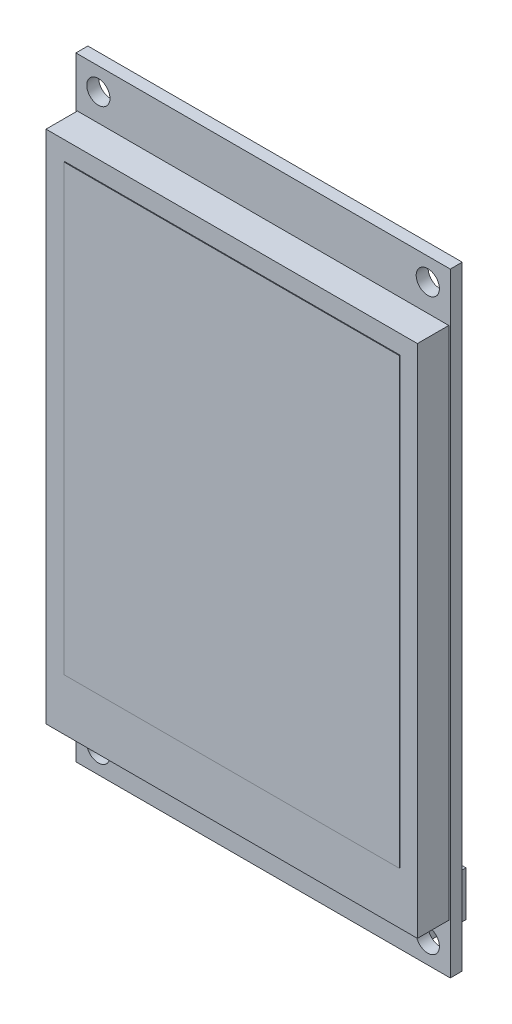
ISO-10303-21;
HEADER;
FILE_DESCRIPTION(('STEP AP214'),'2;1');
FILE_NAME('part.step','',(''),(''),'','','');
FILE_SCHEMA(('AUTOMOTIVE_DESIGN { 1 0 10303 214 1 1 1 1 }'));
ENDSEC;
DATA;
#1=APPLICATION_CONTEXT('core data for automotive mechanical design processes');
#2=APPLICATION_PROTOCOL_DEFINITION('international standard','automotive_design',2000,#1);
#3=PRODUCT_CONTEXT('',#1,'mechanical');
#4=PRODUCT('Part','Part','',(#3));
#5=PRODUCT_RELATED_PRODUCT_CATEGORY('part','',(#4));
#6=PRODUCT_DEFINITION_FORMATION('','',#4);
#7=PRODUCT_DEFINITION_CONTEXT('part definition',#1,'design');
#8=PRODUCT_DEFINITION('design','',#6,#7);
#9=PRODUCT_DEFINITION_SHAPE('','',#8);
#10=(LENGTH_UNIT() NAMED_UNIT(*) SI_UNIT(.MILLI.,.METRE.));
#11=(NAMED_UNIT(*) PLANE_ANGLE_UNIT() SI_UNIT($,.RADIAN.));
#12=(NAMED_UNIT(*) SI_UNIT($,.STERADIAN.) SOLID_ANGLE_UNIT());
#13=UNCERTAINTY_MEASURE_WITH_UNIT(LENGTH_MEASURE(1.E-05),#10,'distance_accuracy_value','');
#14=(GEOMETRIC_REPRESENTATION_CONTEXT(3) GLOBAL_UNCERTAINTY_ASSIGNED_CONTEXT((#13)) GLOBAL_UNIT_ASSIGNED_CONTEXT((#10,
#11,#12)) REPRESENTATION_CONTEXT('',''));
#15=CARTESIAN_POINT('',(0.,0.,0.));
#16=DIRECTION('',(0.,0.,1.));
#17=DIRECTION('',(1.,0.,0.));
#18=AXIS2_PLACEMENT_3D('',#15,#16,#17);
#19=CARTESIAN_POINT('',(25.,-39.,0.));
#20=DIRECTION('',(0.,0.,-1.));
#21=DIRECTION('',(-1.,0.,0.));
#22=AXIS2_PLACEMENT_3D('',#19,#20,#21);
#23=PLANE('',#22);
#24=CARTESIAN_POINT('',(22.,40.,0.));
#25=DIRECTION('',(0.,0.,1.));
#26=DIRECTION('',(1.,0.,0.));
#27=AXIS2_PLACEMENT_3D('',#24,#25,#26);
#28=CIRCLE('',#27,1.55);
#29=CARTESIAN_POINT('',(23.55,40.,0.));
#30=VERTEX_POINT('',#29);
#31=EDGE_CURVE('E405',#30,#30,#28,.T.);
#32=ORIENTED_EDGE('',*,*,#31,.T.);
#33=EDGE_LOOP('',(#32));
#34=FACE_BOUND('',#33,.T.);
#35=CARTESIAN_POINT('',(-22.,-36.07972028525,0.));
#36=DIRECTION('',(0.,0.,1.));
#37=DIRECTION('',(1.,0.,0.));
#38=AXIS2_PLACEMENT_3D('',#35,#36,#37);
#39=CIRCLE('',#38,1.55);
#40=CARTESIAN_POINT('',(-20.45,-36.07972028525,0.));
#41=VERTEX_POINT('',#40);
#42=EDGE_CURVE('E394',#41,#41,#39,.T.);
#43=ORIENTED_EDGE('',*,*,#42,.T.);
#44=EDGE_LOOP('',(#43));
#45=FACE_BOUND('',#44,.T.);
#46=CARTESIAN_POINT('',(22.,-36.08,0.));
#47=DIRECTION('',(0.,0.,1.));
#48=DIRECTION('',(1.,0.,0.));
#49=AXIS2_PLACEMENT_3D('',#46,#47,#48);
#50=CIRCLE('',#49,1.55);
#51=CARTESIAN_POINT('',(23.55,-36.08,0.));
#52=VERTEX_POINT('',#51);
#53=EDGE_CURVE('E391',#52,#52,#50,.T.);
#54=ORIENTED_EDGE('',*,*,#53,.T.);
#55=EDGE_LOOP('',(#54));
#56=FACE_BOUND('',#55,.T.);
#57=CARTESIAN_POINT('',(-22.,40.,0.));
#58=DIRECTION('',(0.,0.,1.));
#59=DIRECTION('',(1.,0.,0.));
#60=AXIS2_PLACEMENT_3D('',#57,#58,#59);
#61=CIRCLE('',#60,1.55);
#62=CARTESIAN_POINT('',(-20.45,40.,0.));
#63=VERTEX_POINT('',#62);
#64=EDGE_CURVE('E409',#63,#63,#61,.T.);
#65=ORIENTED_EDGE('',*,*,#64,.T.);
#66=EDGE_LOOP('',(#65));
#67=FACE_BOUND('',#66,.T.);
#68=DIRECTION('',(0.,-1.,0.));
#69=VECTOR('',#68,1.);
#70=CARTESIAN_POINT('',(-14.,15.2,0.));
#71=LINE('',#70,#69);
#72=CARTESIAN_POINT('',(-14.,17.2,0.));
#73=VERTEX_POINT('',#72);
#74=CARTESIAN_POINT('',(-14.,15.2,0.));
#75=VERTEX_POINT('',#74);
#76=EDGE_CURVE('E68',#73,#75,#71,.T.);
#77=ORIENTED_EDGE('',*,*,#76,.F.);
#78=DIRECTION('',(1.,0.,0.));
#79=VECTOR('',#78,1.);
#80=CARTESIAN_POINT('',(-14.,17.2,0.));
#81=LINE('',#80,#79);
#82=CARTESIAN_POINT('',(-25.,17.2,0.));
#83=VERTEX_POINT('',#82);
#84=EDGE_CURVE('E482',#83,#73,#81,.T.);
#85=ORIENTED_EDGE('',*,*,#84,.F.);
#86=DIRECTION('',(0.,1.,0.));
#87=VECTOR('',#86,1.);
#88=CARTESIAN_POINT('',(-25.,-39.,0.));
#89=LINE('',#88,#87);
#90=CARTESIAN_POINT('',(-25.,43.,0.));
#91=VERTEX_POINT('',#90);
#92=EDGE_CURVE('E273',#83,#91,#89,.T.);
#93=ORIENTED_EDGE('',*,*,#92,.T.);
#94=DIRECTION('',(-1.,0.,0.));
#95=VECTOR('',#94,1.);
#96=CARTESIAN_POINT('',(25.,43.,0.));
#97=LINE('',#96,#95);
#98=CARTESIAN_POINT('',(25.,43.,0.));
#99=VERTEX_POINT('',#98);
#100=EDGE_CURVE('E444',#99,#91,#97,.T.);
#101=ORIENTED_EDGE('',*,*,#100,.F.);
#102=DIRECTION('',(0.,1.,0.));
#103=VECTOR('',#102,1.);
#104=CARTESIAN_POINT('',(25.,-39.,0.));
#105=LINE('',#104,#103);
#106=CARTESIAN_POINT('',(25.,-39.,0.));
#107=VERTEX_POINT('',#106);
#108=EDGE_CURVE('E60',#107,#99,#105,.T.);
#109=ORIENTED_EDGE('',*,*,#108,.F.);
#110=DIRECTION('',(-1.,0.,0.));
#111=VECTOR('',#110,1.);
#112=CARTESIAN_POINT('',(25.,-39.,0.));
#113=LINE('',#112,#111);
#114=CARTESIAN_POINT('',(18.5,-39.,0.));
#115=VERTEX_POINT('',#114);
#116=EDGE_CURVE('E454',#107,#115,#113,.T.);
#117=ORIENTED_EDGE('',*,*,#116,.T.);
#118=DIRECTION('',(0.,-1.,0.));
#119=VECTOR('',#118,1.);
#120=CARTESIAN_POINT('',(18.5,-39.8,0.));
#121=LINE('',#120,#119);
#122=CARTESIAN_POINT('',(18.5,-33.8,0.));
#123=VERTEX_POINT('',#122);
#124=EDGE_CURVE('E376',#123,#115,#121,.T.);
#125=ORIENTED_EDGE('',*,*,#124,.F.);
#126=DIRECTION('',(1.,0.,0.));
#127=VECTOR('',#126,1.);
#128=CARTESIAN_POINT('',(-18.5,-33.8,0.));
#129=LINE('',#128,#127);
#130=CARTESIAN_POINT('',(-18.5,-33.8,0.));
#131=VERTEX_POINT('',#130);
#132=EDGE_CURVE('E375',#131,#123,#129,.T.);
#133=ORIENTED_EDGE('',*,*,#132,.F.);
#134=DIRECTION('',(0.,1.,0.));
#135=VECTOR('',#134,1.);
#136=CARTESIAN_POINT('',(-18.5,-39.8,0.));
#137=LINE('',#136,#135);
#138=CARTESIAN_POINT('',(-18.5,-39.,0.));
#139=VERTEX_POINT('',#138);
#140=EDGE_CURVE('E11',#139,#131,#137,.T.);
#141=ORIENTED_EDGE('',*,*,#140,.F.);
#142=CARTESIAN_POINT('',(-25.,-39.,0.));
#143=VERTEX_POINT('',#142);
#144=EDGE_CURVE('E460',#139,#143,#113,.T.);
#145=ORIENTED_EDGE('',*,*,#144,.T.);
#146=CARTESIAN_POINT('',(-25.,-8.80000000000002,0.));
#147=VERTEX_POINT('',#146);
#148=EDGE_CURVE('E55',#143,#147,#89,.T.);
#149=ORIENTED_EDGE('',*,*,#148,.T.);
#150=DIRECTION('',(-1.,0.,0.));
#151=VECTOR('',#150,1.);
#152=CARTESIAN_POINT('',(-25.,-8.80000000000002,0.));
#153=LINE('',#152,#151);
#154=CARTESIAN_POINT('',(-7.00000000000001,-8.80000000000002,0.));
#155=VERTEX_POINT('',#154);
#156=EDGE_CURVE('E269',#155,#147,#153,.T.);
#157=ORIENTED_EDGE('',*,*,#156,.F.);
#158=DIRECTION('',(0.,-1.,0.));
#159=VECTOR('',#158,1.);
#160=CARTESIAN_POINT('',(-7.,-8.80000000000002,0.));
#161=LINE('',#160,#159);
#162=CARTESIAN_POINT('',(-6.99999999999999,14.2,0.));
#163=VERTEX_POINT('',#162);
#164=EDGE_CURVE('E1005',#163,#155,#161,.T.);
#165=ORIENTED_EDGE('',*,*,#164,.F.);
#166=DIRECTION('',(1.,0.,0.));
#167=VECTOR('',#166,1.);
#168=CARTESIAN_POINT('',(-13.,14.2,0.));
#169=LINE('',#168,#167);
#170=CARTESIAN_POINT('',(-13.,14.2,0.));
#171=VERTEX_POINT('',#170);
#172=EDGE_CURVE('E1007',#171,#163,#169,.T.);
#173=ORIENTED_EDGE('',*,*,#172,.F.);
#174=DIRECTION('',(0.707106781186547,-0.707106781186547,0.));
#175=VECTOR('',#174,1.);
#176=CARTESIAN_POINT('',(-13.,14.2,0.));
#177=LINE('',#176,#175);
#178=EDGE_CURVE('E72',#75,#171,#177,.T.);
#179=ORIENTED_EDGE('',*,*,#178,.F.);
#180=EDGE_LOOP('',(#77,#85,#93,#101,#109,#117,#125,#133,#141,#145,#149,#157,#165,#173,#179));
#181=FACE_BOUND('',#180,.T.);
#182=ADVANCED_FACE('F47',(#34,#45,#56,#67,#181),#23,.T.);
#183=CARTESIAN_POINT('',(25.,-39.,1.6));
#184=DIRECTION('',(1.,0.,0.));
#185=DIRECTION('',(0.,0.,-1.));
#186=AXIS2_PLACEMENT_3D('',#183,#184,#185);
#187=PLANE('',#186);
#188=DIRECTION('',(0.,0.,-1.));
#189=VECTOR('',#188,1.);
#190=CARTESIAN_POINT('',(25.,43.,1.6));
#191=LINE('',#190,#189);
#192=CARTESIAN_POINT('',(25.,43.,1.6));
#193=VERTEX_POINT('',#192);
#194=EDGE_CURVE('E475',#193,#99,#191,.T.);
#195=ORIENTED_EDGE('',*,*,#194,.F.);
#196=DIRECTION('',(0.,1.,0.));
#197=VECTOR('',#196,1.);
#198=CARTESIAN_POINT('',(25.,-39.,1.6));
#199=LINE('',#198,#197);
#200=CARTESIAN_POINT('',(25.,-39.,1.6));
#201=VERTEX_POINT('',#200);
#202=EDGE_CURVE('E476',#201,#193,#199,.T.);
#203=ORIENTED_EDGE('',*,*,#202,.F.);
#204=DIRECTION('',(0.,0.,-1.));
#205=VECTOR('',#204,1.);
#206=CARTESIAN_POINT('',(25.,-39.,1.6));
#207=LINE('',#206,#205);
#208=EDGE_CURVE('E462',#201,#107,#207,.T.);
#209=ORIENTED_EDGE('',*,*,#208,.T.);
#210=ORIENTED_EDGE('',*,*,#108,.T.);
#211=EDGE_LOOP('',(#195,#203,#209,#210));
#212=FACE_BOUND('',#211,.T.);
#213=ADVANCED_FACE('F487',(#212),#187,.T.);
#214=CARTESIAN_POINT('',(-25.,-39.,1.6));
#215=DIRECTION('',(0.,0.,1.));
#216=DIRECTION('',(1.,0.,0.));
#217=AXIS2_PLACEMENT_3D('',#214,#215,#216);
#218=PLANE('',#217);
#219=CARTESIAN_POINT('',(22.,40.,1.6));
#220=DIRECTION('',(0.,0.,1.));
#221=DIRECTION('',(1.,0.,0.));
#222=AXIS2_PLACEMENT_3D('',#219,#220,#221);
#223=CIRCLE('',#222,1.55);
#224=CARTESIAN_POINT('',(23.55,40.,1.6));
#225=VERTEX_POINT('',#224);
#226=EDGE_CURVE('E397',#225,#225,#223,.T.);
#227=ORIENTED_EDGE('',*,*,#226,.F.);
#228=EDGE_LOOP('',(#227));
#229=FACE_BOUND('',#228,.T.);
#230=CARTESIAN_POINT('',(-22.,-36.07972028525,1.6));
#231=DIRECTION('',(0.,0.,1.));
#232=DIRECTION('',(1.,0.,0.));
#233=AXIS2_PLACEMENT_3D('',#230,#231,#232);
#234=CIRCLE('',#233,1.55);
#235=CARTESIAN_POINT('',(-20.45,-36.07972028525,1.6));
#236=VERTEX_POINT('',#235);
#237=EDGE_CURVE('E403',#236,#236,#234,.T.);
#238=ORIENTED_EDGE('',*,*,#237,.F.);
#239=EDGE_LOOP('',(#238));
#240=FACE_BOUND('',#239,.T.);
#241=CARTESIAN_POINT('',(22.,-36.08,1.6));
#242=DIRECTION('',(0.,0.,1.));
#243=DIRECTION('',(1.,0.,0.));
#244=AXIS2_PLACEMENT_3D('',#241,#242,#243);
#245=CIRCLE('',#244,1.55);
#246=CARTESIAN_POINT('',(23.55,-36.08,1.6));
#247=VERTEX_POINT('',#246);
#248=EDGE_CURVE('E395',#247,#247,#245,.T.);
#249=ORIENTED_EDGE('',*,*,#248,.F.);
#250=EDGE_LOOP('',(#249));
#251=FACE_BOUND('',#250,.T.);
#252=CARTESIAN_POINT('',(-22.,40.,1.6));
#253=DIRECTION('',(0.,0.,1.));
#254=DIRECTION('',(1.,0.,0.));
#255=AXIS2_PLACEMENT_3D('',#252,#253,#254);
#256=CIRCLE('',#255,1.55);
#257=CARTESIAN_POINT('',(-20.45,40.,1.6));
#258=VERTEX_POINT('',#257);
#259=EDGE_CURVE('E402',#258,#258,#256,.T.);
#260=ORIENTED_EDGE('',*,*,#259,.F.);
#261=EDGE_LOOP('',(#260));
#262=FACE_BOUND('',#261,.T.);
#263=DIRECTION('',(0.,1.,0.));
#264=VECTOR('',#263,1.);
#265=CARTESIAN_POINT('',(24.8,-32.42100667811,1.6));
#266=LINE('',#265,#264);
#267=CARTESIAN_POINT('',(24.8,-32.42100667811,1.6));
#268=VERTEX_POINT('',#267);
#269=CARTESIAN_POINT('',(24.8,36.378993321881,1.6));
#270=VERTEX_POINT('',#269);
#271=EDGE_CURVE('E412',#268,#270,#266,.T.);
#272=ORIENTED_EDGE('',*,*,#271,.F.);
#273=DIRECTION('',(1.,0.,0.));
#274=VECTOR('',#273,1.);
#275=CARTESIAN_POINT('',(-24.8,-32.42100667811,1.6));
#276=LINE('',#275,#274);
#277=CARTESIAN_POINT('',(-24.8,-32.42100667811,1.6));
#278=VERTEX_POINT('',#277);
#279=EDGE_CURVE('E424',#278,#268,#276,.T.);
#280=ORIENTED_EDGE('',*,*,#279,.F.);
#281=DIRECTION('',(0.,-1.,0.));
#282=VECTOR('',#281,1.);
#283=CARTESIAN_POINT('',(-24.8,36.378993321881,1.6));
#284=LINE('',#283,#282);
#285=CARTESIAN_POINT('',(-24.8,36.378993321881,1.6));
#286=VERTEX_POINT('',#285);
#287=EDGE_CURVE('E423',#286,#278,#284,.T.);
#288=ORIENTED_EDGE('',*,*,#287,.F.);
#289=DIRECTION('',(-1.,0.,0.));
#290=VECTOR('',#289,1.);
#291=CARTESIAN_POINT('',(24.8,36.378993321881,1.6));
#292=LINE('',#291,#290);
#293=EDGE_CURVE('E416',#270,#286,#292,.T.);
#294=ORIENTED_EDGE('',*,*,#293,.F.);
#295=EDGE_LOOP('',(#272,#280,#288,#294));
#296=FACE_BOUND('',#295,.T.);
#297=DIRECTION('',(1.,0.,0.));
#298=VECTOR('',#297,1.);
#299=CARTESIAN_POINT('',(-25.,43.,1.6));
#300=LINE('',#299,#298);
#301=CARTESIAN_POINT('',(-25.,43.,1.6));
#302=VERTEX_POINT('',#301);
#303=EDGE_CURVE('E473',#302,#193,#300,.T.);
#304=ORIENTED_EDGE('',*,*,#303,.F.);
#305=DIRECTION('',(0.,1.,0.));
#306=VECTOR('',#305,1.);
#307=CARTESIAN_POINT('',(-25.,-39.,1.6));
#308=LINE('',#307,#306);
#309=CARTESIAN_POINT('',(-25.,-39.,1.6));
#310=VERTEX_POINT('',#309);
#311=EDGE_CURVE('E479',#310,#302,#308,.T.);
#312=ORIENTED_EDGE('',*,*,#311,.F.);
#313=DIRECTION('',(1.,0.,0.));
#314=VECTOR('',#313,1.);
#315=CARTESIAN_POINT('',(-25.,-39.,1.6));
#316=LINE('',#315,#314);
#317=EDGE_CURVE('E458',#310,#201,#316,.T.);
#318=ORIENTED_EDGE('',*,*,#317,.T.);
#319=ORIENTED_EDGE('',*,*,#202,.T.);
#320=EDGE_LOOP('',(#304,#312,#318,#319));
#321=FACE_BOUND('',#320,.T.);
#322=ADVANCED_FACE('F502',(#229,#240,#251,#262,#296,#321),#218,.T.);
#323=CARTESIAN_POINT('',(-25.,-39.,0.));
#324=DIRECTION('',(-1.,0.,0.));
#325=DIRECTION('',(0.,0.,1.));
#326=AXIS2_PLACEMENT_3D('',#323,#324,#325);
#327=PLANE('',#326);
#328=DIRECTION('',(0.,0.,1.));
#329=VECTOR('',#328,1.);
#330=CARTESIAN_POINT('',(-25.,43.,0.));
#331=LINE('',#330,#329);
#332=EDGE_CURVE('E467',#91,#302,#331,.T.);
#333=ORIENTED_EDGE('',*,*,#332,.F.);
#334=ORIENTED_EDGE('',*,*,#92,.F.);
#335=DIRECTION('',(0.,0.,1.));
#336=VECTOR('',#335,1.);
#337=CARTESIAN_POINT('',(-25.,17.2,-3.7));
#338=LINE('',#337,#336);
#339=CARTESIAN_POINT('',(-25.,17.2,-3.7));
#340=VERTEX_POINT('',#339);
#341=EDGE_CURVE('E254',#340,#83,#338,.T.);
#342=ORIENTED_EDGE('',*,*,#341,.F.);
#343=DIRECTION('',(0.,1.,0.));
#344=VECTOR('',#343,1.);
#345=CARTESIAN_POINT('',(-25.,17.2,-3.7));
#346=LINE('',#345,#344);
#347=CARTESIAN_POINT('',(-25.,-8.80000000000002,-3.7));
#348=VERTEX_POINT('',#347);
#349=EDGE_CURVE('E261',#348,#340,#346,.T.);
#350=ORIENTED_EDGE('',*,*,#349,.F.);
#351=DIRECTION('',(0.,0.,1.));
#352=VECTOR('',#351,1.);
#353=CARTESIAN_POINT('',(-25.,-8.80000000000002,-3.7));
#354=LINE('',#353,#352);
#355=EDGE_CURVE('E501',#348,#147,#354,.T.);
#356=ORIENTED_EDGE('',*,*,#355,.T.);
#357=ORIENTED_EDGE('',*,*,#148,.F.);
#358=DIRECTION('',(0.,0.,1.));
#359=VECTOR('',#358,1.);
#360=CARTESIAN_POINT('',(-25.,-39.,0.));
#361=LINE('',#360,#359);
#362=EDGE_CURVE('E451',#143,#310,#361,.T.);
#363=ORIENTED_EDGE('',*,*,#362,.T.);
#364=ORIENTED_EDGE('',*,*,#311,.T.);
#365=EDGE_LOOP('',(#333,#334,#342,#350,#356,#357,#363,#364));
#366=FACE_BOUND('',#365,.T.);
#367=ADVANCED_FACE('F272',(#366),#327,.T.);
#368=CARTESIAN_POINT('',(0.,-39.,0.));
#369=DIRECTION('',(0.,1.,0.));
#370=DIRECTION('',(0.,0.,1.));
#371=AXIS2_PLACEMENT_3D('',#368,#369,#370);
#372=PLANE('',#371);
#373=ORIENTED_EDGE('',*,*,#116,.F.);
#374=ORIENTED_EDGE('',*,*,#208,.F.);
#375=ORIENTED_EDGE('',*,*,#317,.F.);
#376=ORIENTED_EDGE('',*,*,#362,.F.);
#377=ORIENTED_EDGE('',*,*,#144,.F.);
#378=EDGE_CURVE('E457',#115,#139,#113,.T.);
#379=ORIENTED_EDGE('',*,*,#378,.F.);
#380=EDGE_LOOP('',(#373,#374,#375,#376,#377,#379));
#381=FACE_BOUND('',#380,.T.);
#382=ADVANCED_FACE('F493',(#381),#372,.F.);
#383=CARTESIAN_POINT('',(0.,43.,0.));
#384=DIRECTION('',(0.,1.,0.));
#385=DIRECTION('',(0.,0.,1.));
#386=AXIS2_PLACEMENT_3D('',#383,#384,#385);
#387=PLANE('',#386);
#388=ORIENTED_EDGE('',*,*,#100,.T.);
#389=ORIENTED_EDGE('',*,*,#332,.T.);
#390=ORIENTED_EDGE('',*,*,#303,.T.);
#391=ORIENTED_EDGE('',*,*,#194,.T.);
#392=EDGE_LOOP('',(#388,#389,#390,#391));
#393=FACE_BOUND('',#392,.T.);
#394=ADVANCED_FACE('F486',(#393),#387,.T.);
#395=CARTESIAN_POINT('',(-24.8,-32.42100667811,288600.291716034));
#396=DIRECTION('',(0.,1.,0.));
#397=DIRECTION('',(0.,0.,1.));
#398=AXIS2_PLACEMENT_3D('',#395,#396,#397);
#399=PLANE('',#398);
#400=DIRECTION('',(1.,0.,0.));
#401=VECTOR('',#400,1.);
#402=CARTESIAN_POINT('',(-24.8,-32.42100667811,5.78999999999041));
#403=LINE('',#402,#401);
#404=CARTESIAN_POINT('',(-24.8,-32.42100667811,5.78999999999041));
#405=VERTEX_POINT('',#404);
#406=CARTESIAN_POINT('',(24.8,-32.42100667811,5.79));
#407=VERTEX_POINT('',#406);
#408=EDGE_CURVE('E439',#405,#407,#403,.T.);
#409=ORIENTED_EDGE('',*,*,#408,.F.);
#410=DIRECTION('',(0.,0.,-1.));
#411=VECTOR('',#410,1.);
#412=CARTESIAN_POINT('',(-24.8,-32.42100667811,288600.291716034));
#413=LINE('',#412,#411);
#414=EDGE_CURVE('E429',#405,#278,#413,.T.);
#415=ORIENTED_EDGE('',*,*,#414,.T.);
#416=ORIENTED_EDGE('',*,*,#279,.T.);
#417=DIRECTION('',(0.,0.,-1.));
#418=VECTOR('',#417,1.);
#419=CARTESIAN_POINT('',(24.8,-32.42100667811,288600.291716034));
#420=LINE('',#419,#418);
#421=EDGE_CURVE('E430',#407,#268,#420,.T.);
#422=ORIENTED_EDGE('',*,*,#421,.F.);
#423=EDGE_LOOP('',(#409,#415,#416,#422));
#424=FACE_BOUND('',#423,.T.);
#425=ADVANCED_FACE('F543',(#424),#399,.F.);
#426=CARTESIAN_POINT('',(-24.8,36.378993321881,288600.291716034));
#427=DIRECTION('',(1.,0.,0.));
#428=DIRECTION('',(0.,0.,-1.));
#429=AXIS2_PLACEMENT_3D('',#426,#427,#428);
#430=PLANE('',#429);
#431=DIRECTION('',(0.,-1.,0.));
#432=VECTOR('',#431,1.);
#433=CARTESIAN_POINT('',(-24.8,36.378993321881,5.78999999999041));
#434=LINE('',#433,#432);
#435=CARTESIAN_POINT('',(-24.8,36.378993321881,5.79));
#436=VERTEX_POINT('',#435);
#437=EDGE_CURVE('E438',#436,#405,#434,.T.);
#438=ORIENTED_EDGE('',*,*,#437,.F.);
#439=DIRECTION('',(0.,0.,-1.));
#440=VECTOR('',#439,1.);
#441=CARTESIAN_POINT('',(-24.8,36.378993321881,288600.291716034));
#442=LINE('',#441,#440);
#443=EDGE_CURVE('E433',#436,#286,#442,.T.);
#444=ORIENTED_EDGE('',*,*,#443,.T.);
#445=ORIENTED_EDGE('',*,*,#287,.T.);
#446=ORIENTED_EDGE('',*,*,#414,.F.);
#447=EDGE_LOOP('',(#438,#444,#445,#446));
#448=FACE_BOUND('',#447,.T.);
#449=ADVANCED_FACE('F550',(#448),#430,.F.);
#450=CARTESIAN_POINT('',(24.8,36.378993321881,288600.291716034));
#451=DIRECTION('',(0.,-1.,0.));
#452=DIRECTION('',(0.,0.,-1.));
#453=AXIS2_PLACEMENT_3D('',#450,#451,#452);
#454=PLANE('',#453);
#455=DIRECTION('',(-1.,0.,0.));
#456=VECTOR('',#455,1.);
#457=CARTESIAN_POINT('',(24.8,36.378993321881,5.78999999999041));
#458=LINE('',#457,#456);
#459=CARTESIAN_POINT('',(24.8,36.378993321881,5.79));
#460=VERTEX_POINT('',#459);
#461=EDGE_CURVE('E450',#460,#436,#458,.T.);
#462=ORIENTED_EDGE('',*,*,#461,.F.);
#463=DIRECTION('',(0.,0.,-1.));
#464=VECTOR('',#463,1.);
#465=CARTESIAN_POINT('',(24.8,36.378993321881,288600.291716034));
#466=LINE('',#465,#464);
#467=EDGE_CURVE('E436',#460,#270,#466,.T.);
#468=ORIENTED_EDGE('',*,*,#467,.T.);
#469=ORIENTED_EDGE('',*,*,#293,.T.);
#470=ORIENTED_EDGE('',*,*,#443,.F.);
#471=EDGE_LOOP('',(#462,#468,#469,#470));
#472=FACE_BOUND('',#471,.T.);
#473=ADVANCED_FACE('F552',(#472),#454,.F.);
#474=CARTESIAN_POINT('',(24.8,-32.42100667811,288600.291716034));
#475=DIRECTION('',(-1.,0.,0.));
#476=DIRECTION('',(0.,0.,1.));
#477=AXIS2_PLACEMENT_3D('',#474,#475,#476);
#478=PLANE('',#477);
#479=DIRECTION('',(0.,1.,0.));
#480=VECTOR('',#479,1.);
#481=CARTESIAN_POINT('',(24.8,-32.42100667811,5.78999999999041));
#482=LINE('',#481,#480);
#483=EDGE_CURVE('E441',#407,#460,#482,.T.);
#484=ORIENTED_EDGE('',*,*,#483,.F.);
#485=ORIENTED_EDGE('',*,*,#421,.T.);
#486=ORIENTED_EDGE('',*,*,#271,.T.);
#487=ORIENTED_EDGE('',*,*,#467,.F.);
#488=EDGE_LOOP('',(#484,#485,#486,#487));
#489=FACE_BOUND('',#488,.T.);
#490=ADVANCED_FACE('F539',(#489),#478,.F.);
#491=CARTESIAN_POINT('',(0.,1.978993321881,5.79));
#492=DIRECTION('',(0.,0.,1.));
#493=DIRECTION('',(1.,0.,0.));
#494=AXIS2_PLACEMENT_3D('',#491,#492,#493);
#495=PLANE('',#494);
#496=DIRECTION('',(0.,-1.,0.));
#497=VECTOR('',#496,1.);
#498=CARTESIAN_POINT('',(-22.3,33.878993321881,5.79));
#499=LINE('',#498,#497);
#500=CARTESIAN_POINT('',(-22.3,33.878993321881,5.79));
#501=VERTEX_POINT('',#500);
#502=CARTESIAN_POINT('',(-22.3,-25.42100667811,5.79));
#503=VERTEX_POINT('',#502);
#504=EDGE_CURVE('E274',#501,#503,#499,.T.);
#505=ORIENTED_EDGE('',*,*,#504,.F.);
#506=DIRECTION('',(-1.,0.,0.));
#507=VECTOR('',#506,1.);
#508=CARTESIAN_POINT('',(-22.3,33.878993321881,5.79));
#509=LINE('',#508,#507);
#510=CARTESIAN_POINT('',(22.5,33.878993321881,5.79));
#511=VERTEX_POINT('',#510);
#512=EDGE_CURVE('E287',#511,#501,#509,.T.);
#513=ORIENTED_EDGE('',*,*,#512,.F.);
#514=DIRECTION('',(0.,1.,0.));
#515=VECTOR('',#514,1.);
#516=CARTESIAN_POINT('',(22.5,33.878993321881,5.79));
#517=LINE('',#516,#515);
#518=CARTESIAN_POINT('',(22.5,-25.42100667811,5.79));
#519=VERTEX_POINT('',#518);
#520=EDGE_CURVE('E300',#519,#511,#517,.T.);
#521=ORIENTED_EDGE('',*,*,#520,.F.);
#522=DIRECTION('',(1.,0.,0.));
#523=VECTOR('',#522,1.);
#524=CARTESIAN_POINT('',(-22.3,-25.42100667811,5.79));
#525=LINE('',#524,#523);
#526=EDGE_CURVE('E279',#503,#519,#525,.T.);
#527=ORIENTED_EDGE('',*,*,#526,.F.);
#528=EDGE_LOOP('',(#505,#513,#521,#527));
#529=FACE_BOUND('',#528,.T.);
#530=ORIENTED_EDGE('',*,*,#461,.T.);
#531=ORIENTED_EDGE('',*,*,#437,.T.);
#532=ORIENTED_EDGE('',*,*,#408,.T.);
#533=ORIENTED_EDGE('',*,*,#483,.T.);
#534=EDGE_LOOP('',(#530,#531,#532,#533));
#535=FACE_BOUND('',#534,.T.);
#536=ADVANCED_FACE('F533',(#529,#535),#495,.T.);
#537=CARTESIAN_POINT('',(-22.,40.,0.));
#538=DIRECTION('',(0.,0.,1.));
#539=DIRECTION('',(1.,0.,0.));
#540=AXIS2_PLACEMENT_3D('',#537,#538,#539);
#541=CYLINDRICAL_SURFACE('',#540,1.55);
#542=ORIENTED_EDGE('',*,*,#64,.F.);
#543=EDGE_LOOP('',(#542));
#544=FACE_BOUND('',#543,.T.);
#545=ORIENTED_EDGE('',*,*,#259,.T.);
#546=EDGE_LOOP('',(#545));
#547=FACE_BOUND('',#546,.T.);
#548=ADVANCED_FACE('F527',(#544,#547),#541,.F.);
#549=CARTESIAN_POINT('',(22.,-36.08,0.));
#550=DIRECTION('',(0.,0.,1.));
#551=DIRECTION('',(1.,0.,0.));
#552=AXIS2_PLACEMENT_3D('',#549,#550,#551);
#553=CYLINDRICAL_SURFACE('',#552,1.55);
#554=ORIENTED_EDGE('',*,*,#53,.F.);
#555=EDGE_LOOP('',(#554));
#556=FACE_BOUND('',#555,.T.);
#557=ORIENTED_EDGE('',*,*,#248,.T.);
#558=EDGE_LOOP('',(#557));
#559=FACE_BOUND('',#558,.T.);
#560=ADVANCED_FACE('F529',(#556,#559),#553,.F.);
#561=CARTESIAN_POINT('',(-22.,-36.07972028525,0.));
#562=DIRECTION('',(0.,0.,1.));
#563=DIRECTION('',(1.,0.,0.));
#564=AXIS2_PLACEMENT_3D('',#561,#562,#563);
#565=CYLINDRICAL_SURFACE('',#564,1.55);
#566=ORIENTED_EDGE('',*,*,#42,.F.);
#567=EDGE_LOOP('',(#566));
#568=FACE_BOUND('',#567,.T.);
#569=ORIENTED_EDGE('',*,*,#237,.T.);
#570=EDGE_LOOP('',(#569));
#571=FACE_BOUND('',#570,.T.);
#572=ADVANCED_FACE('F581',(#568,#571),#565,.F.);
#573=CARTESIAN_POINT('',(22.,40.,0.));
#574=DIRECTION('',(0.,0.,1.));
#575=DIRECTION('',(1.,0.,0.));
#576=AXIS2_PLACEMENT_3D('',#573,#574,#575);
#577=CYLINDRICAL_SURFACE('',#576,1.55);
#578=ORIENTED_EDGE('',*,*,#31,.F.);
#579=EDGE_LOOP('',(#578));
#580=FACE_BOUND('',#579,.T.);
#581=ORIENTED_EDGE('',*,*,#226,.T.);
#582=EDGE_LOOP('',(#581));
#583=FACE_BOUND('',#582,.T.);
#584=ADVANCED_FACE('F590',(#580,#583),#577,.F.);
#585=CARTESIAN_POINT('',(0.,0.,0.));
#586=DIRECTION('',(0.,0.,-1.));
#587=DIRECTION('',(-1.,0.,0.));
#588=AXIS2_PLACEMENT_3D('',#585,#586,#587);
#589=PLANE('',#588);
#590=CARTESIAN_POINT('',(18.5,-39.8,0.));
#591=VERTEX_POINT('',#590);
#592=EDGE_CURVE('E374',#115,#591,#121,.T.);
#593=ORIENTED_EDGE('',*,*,#592,.F.);
#594=ORIENTED_EDGE('',*,*,#378,.T.);
#595=CARTESIAN_POINT('',(-18.5,-39.8,0.));
#596=VERTEX_POINT('',#595);
#597=EDGE_CURVE('E56',#596,#139,#137,.T.);
#598=ORIENTED_EDGE('',*,*,#597,.F.);
#599=DIRECTION('',(-1.,0.,0.));
#600=VECTOR('',#599,1.);
#601=CARTESIAN_POINT('',(-18.5,-39.8,0.));
#602=LINE('',#601,#600);
#603=EDGE_CURVE('E365',#591,#596,#602,.T.);
#604=ORIENTED_EDGE('',*,*,#603,.F.);
#605=EDGE_LOOP('',(#593,#594,#598,#604));
#606=FACE_BOUND('',#605,.T.);
#607=ADVANCED_FACE('F594',(#606),#589,.F.);
#608=CARTESIAN_POINT('',(-18.5,-39.8,-7.));
#609=DIRECTION('',(1.,0.,0.));
#610=DIRECTION('',(0.,0.,-1.));
#611=AXIS2_PLACEMENT_3D('',#608,#609,#610);
#612=PLANE('',#611);
#613=ORIENTED_EDGE('',*,*,#597,.T.);
#614=ORIENTED_EDGE('',*,*,#140,.T.);
#615=DIRECTION('',(0.,0.,1.));
#616=VECTOR('',#615,1.);
#617=CARTESIAN_POINT('',(-18.5,-33.8,-7.));
#618=LINE('',#617,#616);
#619=CARTESIAN_POINT('',(-18.5,-33.8,-7.));
#620=VERTEX_POINT('',#619);
#621=EDGE_CURVE('E389',#620,#131,#618,.T.);
#622=ORIENTED_EDGE('',*,*,#621,.F.);
#623=DIRECTION('',(0.,1.,0.));
#624=VECTOR('',#623,1.);
#625=CARTESIAN_POINT('',(-18.5,-39.8,-7.));
#626=LINE('',#625,#624);
#627=CARTESIAN_POINT('',(-18.5,-39.8,-7.));
#628=VERTEX_POINT('',#627);
#629=EDGE_CURVE('E356',#628,#620,#626,.T.);
#630=ORIENTED_EDGE('',*,*,#629,.F.);
#631=DIRECTION('',(0.,0.,1.));
#632=VECTOR('',#631,1.);
#633=CARTESIAN_POINT('',(-18.5,-39.8,-7.));
#634=LINE('',#633,#632);
#635=EDGE_CURVE('E369',#628,#596,#634,.T.);
#636=ORIENTED_EDGE('',*,*,#635,.T.);
#637=EDGE_LOOP('',(#613,#614,#622,#630,#636));
#638=FACE_BOUND('',#637,.T.);
#639=ADVANCED_FACE('F604',(#638),#612,.F.);
#640=CARTESIAN_POINT('',(-18.5,-33.8,-7.));
#641=DIRECTION('',(0.,-1.,0.));
#642=DIRECTION('',(0.,0.,-1.));
#643=AXIS2_PLACEMENT_3D('',#640,#641,#642);
#644=PLANE('',#643);
#645=ORIENTED_EDGE('',*,*,#132,.T.);
#646=DIRECTION('',(0.,0.,1.));
#647=VECTOR('',#646,1.);
#648=CARTESIAN_POINT('',(18.5,-33.8,-7.));
#649=LINE('',#648,#647);
#650=CARTESIAN_POINT('',(18.5,-33.8,-7.));
#651=VERTEX_POINT('',#650);
#652=EDGE_CURVE('E384',#651,#123,#649,.T.);
#653=ORIENTED_EDGE('',*,*,#652,.F.);
#654=DIRECTION('',(1.,0.,0.));
#655=VECTOR('',#654,1.);
#656=CARTESIAN_POINT('',(-18.5,-33.8,-7.));
#657=LINE('',#656,#655);
#658=EDGE_CURVE('E361',#620,#651,#657,.T.);
#659=ORIENTED_EDGE('',*,*,#658,.F.);
#660=ORIENTED_EDGE('',*,*,#621,.T.);
#661=EDGE_LOOP('',(#645,#653,#659,#660));
#662=FACE_BOUND('',#661,.T.);
#663=ADVANCED_FACE('F618',(#662),#644,.F.);
#664=CARTESIAN_POINT('',(18.5,-39.8,-7.));
#665=DIRECTION('',(-1.,0.,0.));
#666=DIRECTION('',(0.,0.,1.));
#667=AXIS2_PLACEMENT_3D('',#664,#665,#666);
#668=PLANE('',#667);
#669=ORIENTED_EDGE('',*,*,#124,.T.);
#670=ORIENTED_EDGE('',*,*,#592,.T.);
#671=DIRECTION('',(0.,0.,1.));
#672=VECTOR('',#671,1.);
#673=CARTESIAN_POINT('',(18.5,-39.8,-7.));
#674=LINE('',#673,#672);
#675=CARTESIAN_POINT('',(18.5,-39.8,-7.));
#676=VERTEX_POINT('',#675);
#677=EDGE_CURVE('E385',#676,#591,#674,.T.);
#678=ORIENTED_EDGE('',*,*,#677,.F.);
#679=DIRECTION('',(0.,-1.,0.));
#680=VECTOR('',#679,1.);
#681=CARTESIAN_POINT('',(18.5,-39.8,-7.));
#682=LINE('',#681,#680);
#683=EDGE_CURVE('E368',#651,#676,#682,.T.);
#684=ORIENTED_EDGE('',*,*,#683,.F.);
#685=ORIENTED_EDGE('',*,*,#652,.T.);
#686=EDGE_LOOP('',(#669,#670,#678,#684,#685));
#687=FACE_BOUND('',#686,.T.);
#688=ADVANCED_FACE('F627',(#687),#668,.F.);
#689=CARTESIAN_POINT('',(-18.5,-39.8,-7.));
#690=DIRECTION('',(0.,1.,0.));
#691=DIRECTION('',(0.,0.,1.));
#692=AXIS2_PLACEMENT_3D('',#689,#690,#691);
#693=PLANE('',#692);
#694=ORIENTED_EDGE('',*,*,#603,.T.);
#695=ORIENTED_EDGE('',*,*,#635,.F.);
#696=DIRECTION('',(-1.,0.,0.));
#697=VECTOR('',#696,1.);
#698=CARTESIAN_POINT('',(-18.5,-39.8,-7.));
#699=LINE('',#698,#697);
#700=EDGE_CURVE('E366',#676,#628,#699,.T.);
#701=ORIENTED_EDGE('',*,*,#700,.F.);
#702=ORIENTED_EDGE('',*,*,#677,.T.);
#703=EDGE_LOOP('',(#694,#695,#701,#702));
#704=FACE_BOUND('',#703,.T.);
#705=ADVANCED_FACE('F639',(#704),#693,.F.);
#706=CARTESIAN_POINT('',(0.,0.,-7.));
#707=DIRECTION('',(0.,0.,-1.));
#708=DIRECTION('',(-1.,0.,0.));
#709=AXIS2_PLACEMENT_3D('',#706,#707,#708);
#710=PLANE('',#709);
#711=DIRECTION('',(0.,1.,0.));
#712=VECTOR('',#711,1.);
#713=CARTESIAN_POINT('',(-17.7,-39.8,-7.));
#714=LINE('',#713,#712);
#715=CARTESIAN_POINT('',(-17.7,-39.,-7.));
#716=VERTEX_POINT('',#715);
#717=CARTESIAN_POINT('',(-17.7,-34.6,-7.));
#718=VERTEX_POINT('',#717);
#719=EDGE_CURVE('E329',#716,#718,#714,.T.);
#720=ORIENTED_EDGE('',*,*,#719,.F.);
#721=DIRECTION('',(-1.,0.,0.));
#722=VECTOR('',#721,1.);
#723=CARTESIAN_POINT('',(-18.5,-39.,-7.));
#724=LINE('',#723,#722);
#725=CARTESIAN_POINT('',(17.7,-39.,-7.));
#726=VERTEX_POINT('',#725);
#727=EDGE_CURVE('E337',#726,#716,#724,.T.);
#728=ORIENTED_EDGE('',*,*,#727,.F.);
#729=DIRECTION('',(0.,-1.,0.));
#730=VECTOR('',#729,1.);
#731=CARTESIAN_POINT('',(17.7,-39.8,-7.));
#732=LINE('',#731,#730);
#733=CARTESIAN_POINT('',(17.7,-34.6,-7.));
#734=VERTEX_POINT('',#733);
#735=EDGE_CURVE('E355',#734,#726,#732,.T.);
#736=ORIENTED_EDGE('',*,*,#735,.F.);
#737=DIRECTION('',(1.,0.,0.));
#738=VECTOR('',#737,1.);
#739=CARTESIAN_POINT('',(-18.5,-34.6,-7.));
#740=LINE('',#739,#738);
#741=EDGE_CURVE('E348',#718,#734,#740,.T.);
#742=ORIENTED_EDGE('',*,*,#741,.F.);
#743=EDGE_LOOP('',(#720,#728,#736,#742));
#744=FACE_BOUND('',#743,.T.);
#745=ORIENTED_EDGE('',*,*,#629,.T.);
#746=ORIENTED_EDGE('',*,*,#658,.T.);
#747=ORIENTED_EDGE('',*,*,#683,.T.);
#748=ORIENTED_EDGE('',*,*,#700,.T.);
#749=EDGE_LOOP('',(#745,#746,#747,#748));
#750=FACE_BOUND('',#749,.T.);
#751=ADVANCED_FACE('F655',(#744,#750),#710,.T.);
#752=CARTESIAN_POINT('',(-18.5,-39.,-7.));
#753=DIRECTION('',(0.,1.,0.));
#754=DIRECTION('',(0.,0.,1.));
#755=AXIS2_PLACEMENT_3D('',#752,#753,#754);
#756=PLANE('',#755);
#757=DIRECTION('',(-1.,0.,0.));
#758=VECTOR('',#757,1.);
#759=CARTESIAN_POINT('',(-18.5,-39.,-0.8));
#760=LINE('',#759,#758);
#761=CARTESIAN_POINT('',(17.7,-39.,-0.8));
#762=VERTEX_POINT('',#761);
#763=CARTESIAN_POINT('',(-17.7,-39.,-0.8));
#764=VERTEX_POINT('',#763);
#765=EDGE_CURVE('E330',#762,#764,#760,.T.);
#766=ORIENTED_EDGE('',*,*,#765,.F.);
#767=DIRECTION('',(0.,0.,1.));
#768=VECTOR('',#767,1.);
#769=CARTESIAN_POINT('',(17.7,-39.,-7.));
#770=LINE('',#769,#768);
#771=EDGE_CURVE('E340',#726,#762,#770,.T.);
#772=ORIENTED_EDGE('',*,*,#771,.F.);
#773=ORIENTED_EDGE('',*,*,#727,.T.);
#774=DIRECTION('',(0.,0.,1.));
#775=VECTOR('',#774,1.);
#776=CARTESIAN_POINT('',(-17.7,-39.,-7.));
#777=LINE('',#776,#775);
#778=EDGE_CURVE('E331',#716,#764,#777,.T.);
#779=ORIENTED_EDGE('',*,*,#778,.T.);
#780=EDGE_LOOP('',(#766,#772,#773,#779));
#781=FACE_BOUND('',#780,.T.);
#782=ADVANCED_FACE('F661',(#781),#756,.T.);
#783=CARTESIAN_POINT('',(17.7,-39.8,-7.));
#784=DIRECTION('',(-1.,0.,0.));
#785=DIRECTION('',(0.,0.,1.));
#786=AXIS2_PLACEMENT_3D('',#783,#784,#785);
#787=PLANE('',#786);
#788=DIRECTION('',(0.,-1.,0.));
#789=VECTOR('',#788,1.);
#790=CARTESIAN_POINT('',(17.7,-39.,0.8));
#791=LINE('',#790,#789);
#792=CARTESIAN_POINT('',(17.7,-34.6,0.8));
#793=VERTEX_POINT('',#792);
#794=CARTESIAN_POINT('',(17.7,-38.2,0.8));
#795=VERTEX_POINT('',#794);
#796=EDGE_CURVE('E346',#793,#795,#791,.T.);
#797=ORIENTED_EDGE('',*,*,#796,.F.);
#798=DIRECTION('',(0.,0.,1.));
#799=VECTOR('',#798,1.);
#800=CARTESIAN_POINT('',(17.7,-34.6,-7.));
#801=LINE('',#800,#799);
#802=EDGE_CURVE('E334',#734,#793,#801,.T.);
#803=ORIENTED_EDGE('',*,*,#802,.F.);
#804=ORIENTED_EDGE('',*,*,#735,.T.);
#805=ORIENTED_EDGE('',*,*,#771,.T.);
#806=DIRECTION('',(0.,-1.,0.));
#807=VECTOR('',#806,1.);
#808=CARTESIAN_POINT('',(17.7,-39.8,-0.8));
#809=LINE('',#808,#807);
#810=CARTESIAN_POINT('',(17.7,-38.2,-0.8));
#811=VERTEX_POINT('',#810);
#812=EDGE_CURVE('E324',#811,#762,#809,.T.);
#813=ORIENTED_EDGE('',*,*,#812,.F.);
#814=DIRECTION('',(0.,0.,-1.));
#815=VECTOR('',#814,1.);
#816=CARTESIAN_POINT('',(17.7,-38.2,-7.));
#817=LINE('',#816,#815);
#818=EDGE_CURVE('E320',#795,#811,#817,.T.);
#819=ORIENTED_EDGE('',*,*,#818,.F.);
#820=EDGE_LOOP('',(#797,#803,#804,#805,#813,#819));
#821=FACE_BOUND('',#820,.T.);
#822=ADVANCED_FACE('F726',(#821),#787,.T.);
#823=CARTESIAN_POINT('',(-18.5,-34.6,-7.));
#824=DIRECTION('',(0.,-1.,0.));
#825=DIRECTION('',(0.,0.,-1.));
#826=AXIS2_PLACEMENT_3D('',#823,#824,#825);
#827=PLANE('',#826);
#828=DIRECTION('',(1.,0.,0.));
#829=VECTOR('',#828,1.);
#830=CARTESIAN_POINT('',(-25.,-34.6,0.8));
#831=LINE('',#830,#829);
#832=CARTESIAN_POINT('',(-17.7,-34.6,0.8));
#833=VERTEX_POINT('',#832);
#834=EDGE_CURVE('E359',#833,#793,#831,.T.);
#835=ORIENTED_EDGE('',*,*,#834,.F.);
#836=DIRECTION('',(0.,0.,1.));
#837=VECTOR('',#836,1.);
#838=CARTESIAN_POINT('',(-17.7,-34.6,-7.));
#839=LINE('',#838,#837);
#840=EDGE_CURVE('E322',#718,#833,#839,.T.);
#841=ORIENTED_EDGE('',*,*,#840,.F.);
#842=ORIENTED_EDGE('',*,*,#741,.T.);
#843=ORIENTED_EDGE('',*,*,#802,.T.);
#844=EDGE_LOOP('',(#835,#841,#842,#843));
#845=FACE_BOUND('',#844,.T.);
#846=ADVANCED_FACE('F719',(#845),#827,.T.);
#847=CARTESIAN_POINT('',(-17.7,-39.8,-7.));
#848=DIRECTION('',(1.,0.,0.));
#849=DIRECTION('',(0.,0.,-1.));
#850=AXIS2_PLACEMENT_3D('',#847,#848,#849);
#851=PLANE('',#850);
#852=DIRECTION('',(0.,1.,0.));
#853=VECTOR('',#852,1.);
#854=CARTESIAN_POINT('',(-17.7,-39.8,-0.8));
#855=LINE('',#854,#853);
#856=CARTESIAN_POINT('',(-17.7,-38.2,-0.8));
#857=VERTEX_POINT('',#856);
#858=EDGE_CURVE('E311',#764,#857,#855,.T.);
#859=ORIENTED_EDGE('',*,*,#858,.F.);
#860=ORIENTED_EDGE('',*,*,#778,.F.);
#861=ORIENTED_EDGE('',*,*,#719,.T.);
#862=ORIENTED_EDGE('',*,*,#840,.T.);
#863=DIRECTION('',(0.,1.,0.));
#864=VECTOR('',#863,1.);
#865=CARTESIAN_POINT('',(-17.7,-39.8,0.8));
#866=LINE('',#865,#864);
#867=CARTESIAN_POINT('',(-17.7,-38.2,0.8));
#868=VERTEX_POINT('',#867);
#869=EDGE_CURVE('E314',#868,#833,#866,.T.);
#870=ORIENTED_EDGE('',*,*,#869,.F.);
#871=DIRECTION('',(0.,0.,-1.));
#872=VECTOR('',#871,1.);
#873=CARTESIAN_POINT('',(-17.7,-38.2,0.));
#874=LINE('',#873,#872);
#875=EDGE_CURVE('E341',#868,#857,#874,.T.);
#876=ORIENTED_EDGE('',*,*,#875,.T.);
#877=EDGE_LOOP('',(#859,#860,#861,#862,#870,#876));
#878=FACE_BOUND('',#877,.T.);
#879=ADVANCED_FACE('F706',(#878),#851,.T.);
#880=CARTESIAN_POINT('',(0.,0.,-0.8));
#881=DIRECTION('',(0.,0.,-1.));
#882=DIRECTION('',(-1.,0.,0.));
#883=AXIS2_PLACEMENT_3D('',#880,#881,#882);
#884=PLANE('',#883);
#885=ORIENTED_EDGE('',*,*,#812,.T.);
#886=ORIENTED_EDGE('',*,*,#765,.T.);
#887=ORIENTED_EDGE('',*,*,#858,.T.);
#888=DIRECTION('',(-1.,0.,0.));
#889=VECTOR('',#888,1.);
#890=CARTESIAN_POINT('',(0.,-38.2,-0.8));
#891=LINE('',#890,#889);
#892=EDGE_CURVE('E321',#811,#857,#891,.T.);
#893=ORIENTED_EDGE('',*,*,#892,.F.);
#894=EDGE_LOOP('',(#885,#886,#887,#893));
#895=FACE_BOUND('',#894,.T.);
#896=ADVANCED_FACE('F695',(#895),#884,.T.);
#897=CARTESIAN_POINT('',(0.,-38.2,0.));
#898=DIRECTION('',(0.,1.,0.));
#899=DIRECTION('',(0.,0.,1.));
#900=AXIS2_PLACEMENT_3D('',#897,#898,#899);
#901=PLANE('',#900);
#902=ORIENTED_EDGE('',*,*,#818,.T.);
#903=ORIENTED_EDGE('',*,*,#892,.T.);
#904=ORIENTED_EDGE('',*,*,#875,.F.);
#905=DIRECTION('',(1.,0.,0.));
#906=VECTOR('',#905,1.);
#907=CARTESIAN_POINT('',(0.,-38.2,0.8));
#908=LINE('',#907,#906);
#909=EDGE_CURVE('E318',#868,#795,#908,.T.);
#910=ORIENTED_EDGE('',*,*,#909,.T.);
#911=EDGE_LOOP('',(#902,#903,#904,#910));
#912=FACE_BOUND('',#911,.T.);
#913=ADVANCED_FACE('F678',(#912),#901,.T.);
#914=CARTESIAN_POINT('',(-25.,-39.,0.8));
#915=DIRECTION('',(0.,0.,1.));
#916=DIRECTION('',(1.,0.,0.));
#917=AXIS2_PLACEMENT_3D('',#914,#915,#916);
#918=PLANE('',#917);
#919=ORIENTED_EDGE('',*,*,#834,.T.);
#920=ORIENTED_EDGE('',*,*,#796,.T.);
#921=ORIENTED_EDGE('',*,*,#909,.F.);
#922=ORIENTED_EDGE('',*,*,#869,.T.);
#923=EDGE_LOOP('',(#919,#920,#921,#922));
#924=FACE_BOUND('',#923,.T.);
#925=ADVANCED_FACE('F674',(#924),#918,.F.);
#926=CARTESIAN_POINT('',(-22.3,33.878993321881,5.89));
#927=DIRECTION('',(1.,0.,0.));
#928=DIRECTION('',(0.,1.,0.));
#929=AXIS2_PLACEMENT_3D('',#926,#927,#928);
#930=PLANE('',#929);
#931=ORIENTED_EDGE('',*,*,#504,.T.);
#932=DIRECTION('',(0.,0.,-1.));
#933=VECTOR('',#932,1.);
#934=CARTESIAN_POINT('',(-22.3,-25.42100667811,5.89));
#935=LINE('',#934,#933);
#936=CARTESIAN_POINT('',(-22.3,-25.42100667811,5.89));
#937=VERTEX_POINT('',#936);
#938=EDGE_CURVE('E309',#937,#503,#935,.T.);
#939=ORIENTED_EDGE('',*,*,#938,.F.);
#940=DIRECTION('',(0.,-1.,0.));
#941=VECTOR('',#940,1.);
#942=CARTESIAN_POINT('',(-22.3,33.878993321881,5.89));
#943=LINE('',#942,#941);
#944=CARTESIAN_POINT('',(-22.3,33.878993321881,5.89));
#945=VERTEX_POINT('',#944);
#946=EDGE_CURVE('E283',#945,#937,#943,.T.);
#947=ORIENTED_EDGE('',*,*,#946,.F.);
#948=DIRECTION('',(0.,0.,-1.));
#949=VECTOR('',#948,1.);
#950=CARTESIAN_POINT('',(-22.3,33.878993321881,5.89));
#951=LINE('',#950,#949);
#952=EDGE_CURVE('E291',#945,#501,#951,.T.);
#953=ORIENTED_EDGE('',*,*,#952,.T.);
#954=EDGE_LOOP('',(#931,#939,#947,#953));
#955=FACE_BOUND('',#954,.T.);
#956=ADVANCED_FACE('F679',(#955),#930,.F.);
#957=CARTESIAN_POINT('',(-22.3,-25.42100667811,5.89));
#958=DIRECTION('',(0.,1.,0.));
#959=DIRECTION('',(0.,0.,1.));
#960=AXIS2_PLACEMENT_3D('',#957,#958,#959);
#961=PLANE('',#960);
#962=ORIENTED_EDGE('',*,*,#526,.T.);
#963=DIRECTION('',(0.,0.,-1.));
#964=VECTOR('',#963,1.);
#965=CARTESIAN_POINT('',(22.5,-25.42100667811,5.89));
#966=LINE('',#965,#964);
#967=CARTESIAN_POINT('',(22.5,-25.42100667811,5.89));
#968=VERTEX_POINT('',#967);
#969=EDGE_CURVE('E307',#968,#519,#966,.T.);
#970=ORIENTED_EDGE('',*,*,#969,.F.);
#971=DIRECTION('',(1.,0.,0.));
#972=VECTOR('',#971,1.);
#973=CARTESIAN_POINT('',(-22.3,-25.42100667811,5.89));
#974=LINE('',#973,#972);
#975=EDGE_CURVE('E289',#937,#968,#974,.T.);
#976=ORIENTED_EDGE('',*,*,#975,.F.);
#977=ORIENTED_EDGE('',*,*,#938,.T.);
#978=EDGE_LOOP('',(#962,#970,#976,#977));
#979=FACE_BOUND('',#978,.T.);
#980=ADVANCED_FACE('F759',(#979),#961,.F.);
#981=CARTESIAN_POINT('',(22.5,33.878993321881,5.89));
#982=DIRECTION('',(-1.,0.,0.));
#983=DIRECTION('',(0.,-1.,0.));
#984=AXIS2_PLACEMENT_3D('',#981,#982,#983);
#985=PLANE('',#984);
#986=ORIENTED_EDGE('',*,*,#520,.T.);
#987=DIRECTION('',(0.,0.,-1.));
#988=VECTOR('',#987,1.);
#989=CARTESIAN_POINT('',(22.5,33.878993321881,5.89));
#990=LINE('',#989,#988);
#991=CARTESIAN_POINT('',(22.5,33.878993321881,5.89));
#992=VERTEX_POINT('',#991);
#993=EDGE_CURVE('E305',#992,#511,#990,.T.);
#994=ORIENTED_EDGE('',*,*,#993,.F.);
#995=DIRECTION('',(0.,1.,0.));
#996=VECTOR('',#995,1.);
#997=CARTESIAN_POINT('',(22.5,33.878993321881,5.89));
#998=LINE('',#997,#996);
#999=EDGE_CURVE('E286',#968,#992,#998,.T.);
#1000=ORIENTED_EDGE('',*,*,#999,.F.);
#1001=ORIENTED_EDGE('',*,*,#969,.T.);
#1002=EDGE_LOOP('',(#986,#994,#1000,#1001));
#1003=FACE_BOUND('',#1002,.T.);
#1004=ADVANCED_FACE('F769',(#1003),#985,.F.);
#1005=CARTESIAN_POINT('',(-22.3,33.878993321881,5.89));
#1006=DIRECTION('',(0.,-1.,0.));
#1007=DIRECTION('',(0.,0.,-1.));
#1008=AXIS2_PLACEMENT_3D('',#1005,#1006,#1007);
#1009=PLANE('',#1008);
#1010=ORIENTED_EDGE('',*,*,#512,.T.);
#1011=ORIENTED_EDGE('',*,*,#952,.F.);
#1012=DIRECTION('',(-1.,0.,0.));
#1013=VECTOR('',#1012,1.);
#1014=CARTESIAN_POINT('',(-22.3,33.878993321881,5.89));
#1015=LINE('',#1014,#1013);
#1016=EDGE_CURVE('E295',#992,#945,#1015,.T.);
#1017=ORIENTED_EDGE('',*,*,#1016,.F.);
#1018=ORIENTED_EDGE('',*,*,#993,.T.);
#1019=EDGE_LOOP('',(#1010,#1011,#1017,#1018));
#1020=FACE_BOUND('',#1019,.T.);
#1021=ADVANCED_FACE('F779',(#1020),#1009,.F.);
#1022=CARTESIAN_POINT('',(0.,0.,5.89));
#1023=DIRECTION('',(0.,0.,1.));
#1024=DIRECTION('',(1.,0.,0.));
#1025=AXIS2_PLACEMENT_3D('',#1022,#1023,#1024);
#1026=PLANE('',#1025);
#1027=ORIENTED_EDGE('',*,*,#946,.T.);
#1028=ORIENTED_EDGE('',*,*,#975,.T.);
#1029=ORIENTED_EDGE('',*,*,#999,.T.);
#1030=ORIENTED_EDGE('',*,*,#1016,.T.);
#1031=EDGE_LOOP('',(#1027,#1028,#1029,#1030));
#1032=FACE_BOUND('',#1031,.T.);
#1033=ADVANCED_FACE('F788',(#1032),#1026,.T.);
#1034=CARTESIAN_POINT('',(-14.,17.2,-3.7));
#1035=DIRECTION('',(0.,-1.,0.));
#1036=DIRECTION('',(0.,0.,-1.));
#1037=AXIS2_PLACEMENT_3D('',#1034,#1035,#1036);
#1038=PLANE('',#1037);
#1039=ORIENTED_EDGE('',*,*,#84,.T.);
#1040=DIRECTION('',(0.,0.,1.));
#1041=VECTOR('',#1040,1.);
#1042=CARTESIAN_POINT('',(-14.,17.2,-3.7));
#1043=LINE('',#1042,#1041);
#1044=CARTESIAN_POINT('',(-14.,17.2,-3.7));
#1045=VERTEX_POINT('',#1044);
#1046=EDGE_CURVE('E260',#1045,#73,#1043,.T.);
#1047=ORIENTED_EDGE('',*,*,#1046,.F.);
#1048=DIRECTION('',(1.,0.,0.));
#1049=VECTOR('',#1048,1.);
#1050=CARTESIAN_POINT('',(-14.,17.2,-3.7));
#1051=LINE('',#1050,#1049);
#1052=EDGE_CURVE('E253',#340,#1045,#1051,.T.);
#1053=ORIENTED_EDGE('',*,*,#1052,.F.);
#1054=ORIENTED_EDGE('',*,*,#341,.T.);
#1055=EDGE_LOOP('',(#1039,#1047,#1053,#1054));
#1056=FACE_BOUND('',#1055,.T.);
#1057=ADVANCED_FACE('F251',(#1056),#1038,.F.);
#1058=CARTESIAN_POINT('',(-14.,15.2,-3.7));
#1059=DIRECTION('',(-1.,0.,0.));
#1060=DIRECTION('',(0.,0.,1.));
#1061=AXIS2_PLACEMENT_3D('',#1058,#1059,#1060);
#1062=PLANE('',#1061);
#1063=ORIENTED_EDGE('',*,*,#76,.T.);
#1064=DIRECTION('',(0.,0.,1.));
#1065=VECTOR('',#1064,1.);
#1066=CARTESIAN_POINT('',(-14.,15.2,-3.7));
#1067=LINE('',#1066,#1065);
#1068=CARTESIAN_POINT('',(-14.,15.2,-3.7));
#1069=VERTEX_POINT('',#1068);
#1070=EDGE_CURVE('E278',#1069,#75,#1067,.T.);
#1071=ORIENTED_EDGE('',*,*,#1070,.F.);
#1072=DIRECTION('',(0.,-1.,0.));
#1073=VECTOR('',#1072,1.);
#1074=CARTESIAN_POINT('',(-14.,15.2,-3.7));
#1075=LINE('',#1074,#1073);
#1076=EDGE_CURVE('E257',#1045,#1069,#1075,.T.);
#1077=ORIENTED_EDGE('',*,*,#1076,.F.);
#1078=ORIENTED_EDGE('',*,*,#1046,.T.);
#1079=EDGE_LOOP('',(#1063,#1071,#1077,#1078));
#1080=FACE_BOUND('',#1079,.T.);
#1081=ADVANCED_FACE('F827',(#1080),#1062,.F.);
#1082=CARTESIAN_POINT('',(-13.,14.2,-3.7));
#1083=DIRECTION('',(-0.707106781186548,-0.707106781186548,0.));
#1084=DIRECTION('',(0.707106781186548,-0.707106781186548,0.));
#1085=AXIS2_PLACEMENT_3D('',#1082,#1083,#1084);
#1086=PLANE('',#1085);
#1087=ORIENTED_EDGE('',*,*,#178,.T.);
#1088=DIRECTION('',(0.,0.,1.));
#1089=VECTOR('',#1088,1.);
#1090=CARTESIAN_POINT('',(-13.,14.2,-3.7));
#1091=LINE('',#1090,#1089);
#1092=CARTESIAN_POINT('',(-13.,14.2,-3.7));
#1093=VERTEX_POINT('',#1092);
#1094=EDGE_CURVE('E1014',#1093,#171,#1091,.T.);
#1095=ORIENTED_EDGE('',*,*,#1094,.F.);
#1096=DIRECTION('',(0.707106781186547,-0.707106781186547,0.));
#1097=VECTOR('',#1096,1.);
#1098=CARTESIAN_POINT('',(-13.,14.2,-3.7));
#1099=LINE('',#1098,#1097);
#1100=EDGE_CURVE('E1023',#1069,#1093,#1099,.T.);
#1101=ORIENTED_EDGE('',*,*,#1100,.F.);
#1102=ORIENTED_EDGE('',*,*,#1070,.T.);
#1103=EDGE_LOOP('',(#1087,#1095,#1101,#1102));
#1104=FACE_BOUND('',#1103,.T.);
#1105=ADVANCED_FACE('F834',(#1104),#1086,.F.);
#1106=CARTESIAN_POINT('',(-13.,14.2,-3.7));
#1107=DIRECTION('',(0.,-1.,0.));
#1108=DIRECTION('',(0.,0.,-1.));
#1109=AXIS2_PLACEMENT_3D('',#1106,#1107,#1108);
#1110=PLANE('',#1109);
#1111=ORIENTED_EDGE('',*,*,#172,.T.);
#1112=DIRECTION('',(0.,0.,1.));
#1113=VECTOR('',#1112,1.);
#1114=CARTESIAN_POINT('',(-7.,14.2,-3.7));
#1115=LINE('',#1114,#1113);
#1116=CARTESIAN_POINT('',(-7.,14.2,-3.7));
#1117=VERTEX_POINT('',#1116);
#1118=EDGE_CURVE('E1015',#1117,#163,#1115,.T.);
#1119=ORIENTED_EDGE('',*,*,#1118,.F.);
#1120=DIRECTION('',(1.,0.,0.));
#1121=VECTOR('',#1120,1.);
#1122=CARTESIAN_POINT('',(-13.,14.2,-3.7));
#1123=LINE('',#1122,#1121);
#1124=EDGE_CURVE('E1031',#1093,#1117,#1123,.T.);
#1125=ORIENTED_EDGE('',*,*,#1124,.F.);
#1126=ORIENTED_EDGE('',*,*,#1094,.T.);
#1127=EDGE_LOOP('',(#1111,#1119,#1125,#1126));
#1128=FACE_BOUND('',#1127,.T.);
#1129=ADVANCED_FACE('F843',(#1128),#1110,.F.);
#1130=CARTESIAN_POINT('',(-7.,-8.80000000000002,-3.7));
#1131=DIRECTION('',(-1.,0.,0.));
#1132=DIRECTION('',(0.,-1.,0.));
#1133=AXIS2_PLACEMENT_3D('',#1130,#1131,#1132);
#1134=PLANE('',#1133);
#1135=ORIENTED_EDGE('',*,*,#164,.T.);
#1136=DIRECTION('',(0.,0.,1.));
#1137=VECTOR('',#1136,1.);
#1138=CARTESIAN_POINT('',(-7.,-8.80000000000002,-3.7));
#1139=LINE('',#1138,#1137);
#1140=CARTESIAN_POINT('',(-7.,-8.80000000000002,-3.7));
#1141=VERTEX_POINT('',#1140);
#1142=EDGE_CURVE('E1004',#1141,#155,#1139,.T.);
#1143=ORIENTED_EDGE('',*,*,#1142,.F.);
#1144=DIRECTION('',(0.,-1.,0.));
#1145=VECTOR('',#1144,1.);
#1146=CARTESIAN_POINT('',(-7.,-8.80000000000002,-3.7));
#1147=LINE('',#1146,#1145);
#1148=EDGE_CURVE('E1027',#1117,#1141,#1147,.T.);
#1149=ORIENTED_EDGE('',*,*,#1148,.F.);
#1150=ORIENTED_EDGE('',*,*,#1118,.T.);
#1151=EDGE_LOOP('',(#1135,#1143,#1149,#1150));
#1152=FACE_BOUND('',#1151,.T.);
#1153=ADVANCED_FACE('F851',(#1152),#1134,.F.);
#1154=CARTESIAN_POINT('',(-25.,-8.80000000000002,-3.7));
#1155=DIRECTION('',(0.,1.,0.));
#1156=DIRECTION('',(0.,0.,1.));
#1157=AXIS2_PLACEMENT_3D('',#1154,#1155,#1156);
#1158=PLANE('',#1157);
#1159=ORIENTED_EDGE('',*,*,#156,.T.);
#1160=ORIENTED_EDGE('',*,*,#355,.F.);
#1161=DIRECTION('',(-1.,0.,0.));
#1162=VECTOR('',#1161,1.);
#1163=CARTESIAN_POINT('',(-25.,-8.80000000000002,-3.7));
#1164=LINE('',#1163,#1162);
#1165=EDGE_CURVE('E266',#1141,#348,#1164,.T.);
#1166=ORIENTED_EDGE('',*,*,#1165,.F.);
#1167=ORIENTED_EDGE('',*,*,#1142,.T.);
#1168=EDGE_LOOP('',(#1159,#1160,#1166,#1167));
#1169=FACE_BOUND('',#1168,.T.);
#1170=ADVANCED_FACE('F862',(#1169),#1158,.F.);
#1171=CARTESIAN_POINT('',(0.,0.,-3.7));
#1172=DIRECTION('',(0.,0.,1.));
#1173=DIRECTION('',(1.,0.,0.));
#1174=AXIS2_PLACEMENT_3D('',#1171,#1172,#1173);
#1175=PLANE('',#1174);
#1176=ORIENTED_EDGE('',*,*,#349,.T.);
#1177=ORIENTED_EDGE('',*,*,#1052,.T.);
#1178=ORIENTED_EDGE('',*,*,#1076,.T.);
#1179=ORIENTED_EDGE('',*,*,#1100,.T.);
#1180=ORIENTED_EDGE('',*,*,#1124,.T.);
#1181=ORIENTED_EDGE('',*,*,#1148,.T.);
#1182=ORIENTED_EDGE('',*,*,#1165,.T.);
#1183=EDGE_LOOP('',(#1176,#1177,#1178,#1179,#1180,#1181,#1182));
#1184=FACE_BOUND('',#1183,.T.);
#1185=ADVANCED_FACE('F262',(#1184),#1175,.F.);
#1186=CLOSED_SHELL('',(#182,#213,#322,#367,#382,#394,#425,#449,#473,#490,#536,#548,#560,#572,
#584,#607,#639,#663,#688,#705,#751,#782,#822,#846,#879,#896,#913,#925,#956,#980,#1004,#1021,
#1033,#1057,#1081,#1105,#1129,#1153,#1170,#1185));
#1187=MANIFOLD_SOLID_BREP('B2',#1186);
#1188=ADVANCED_BREP_SHAPE_REPRESENTATION('',(#18,#1187),#14);
#1189=SHAPE_DEFINITION_REPRESENTATION(#9,#1188);
ENDSEC;
END-ISO-10303-21;
